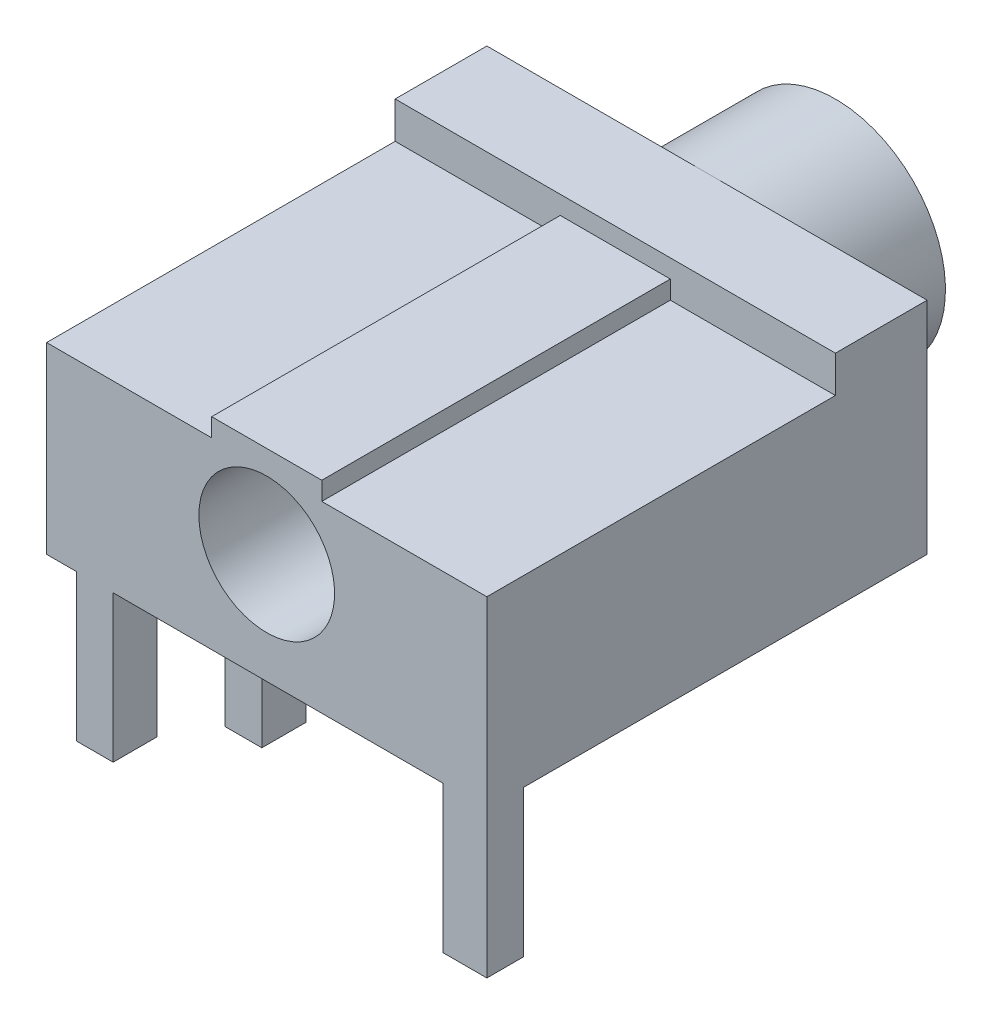
ISO-10303-21;
HEADER;
FILE_DESCRIPTION(('STEP AP214'),'2;1');
FILE_NAME('part.step','',(''),(''),'','','');
FILE_SCHEMA(('AUTOMOTIVE_DESIGN { 1 0 10303 214 1 1 1 1 }'));
ENDSEC;
DATA;
#1=APPLICATION_CONTEXT('core data for automotive mechanical design processes');
#2=APPLICATION_PROTOCOL_DEFINITION('international standard','automotive_design',2000,#1);
#3=PRODUCT_CONTEXT('',#1,'mechanical');
#4=PRODUCT('Part','Part','',(#3));
#5=PRODUCT_RELATED_PRODUCT_CATEGORY('part','',(#4));
#6=PRODUCT_DEFINITION_FORMATION('','',#4);
#7=PRODUCT_DEFINITION_CONTEXT('part definition',#1,'design');
#8=PRODUCT_DEFINITION('design','',#6,#7);
#9=PRODUCT_DEFINITION_SHAPE('','',#8);
#10=(LENGTH_UNIT() NAMED_UNIT(*) SI_UNIT(.MILLI.,.METRE.));
#11=(NAMED_UNIT(*) PLANE_ANGLE_UNIT() SI_UNIT($,.RADIAN.));
#12=(NAMED_UNIT(*) SI_UNIT($,.STERADIAN.) SOLID_ANGLE_UNIT());
#13=UNCERTAINTY_MEASURE_WITH_UNIT(LENGTH_MEASURE(1.E-05),#10,'distance_accuracy_value','');
#14=(GEOMETRIC_REPRESENTATION_CONTEXT(3) GLOBAL_UNCERTAINTY_ASSIGNED_CONTEXT((#13)) GLOBAL_UNIT_ASSIGNED_CONTEXT((#10,
#11,#12)) REPRESENTATION_CONTEXT('',''));
#15=CARTESIAN_POINT('',(0.,0.,0.));
#16=DIRECTION('',(0.,0.,1.));
#17=DIRECTION('',(1.,0.,0.));
#18=AXIS2_PLACEMENT_3D('',#15,#16,#17);
#19=CARTESIAN_POINT('',(0.,0.,0.));
#20=DIRECTION('',(0.,1.,0.));
#21=DIRECTION('',(0.,0.,1.));
#22=AXIS2_PLACEMENT_3D('',#19,#20,#21);
#23=PLANE('',#22);
#24=DIRECTION('',(0.,0.,-1.));
#25=VECTOR('',#24,1.);
#26=CARTESIAN_POINT('',(-1.2,0.,0.));
#27=LINE('',#26,#25);
#28=CARTESIAN_POINT('',(-1.2,0.,0.));
#29=VERTEX_POINT('',#28);
#30=CARTESIAN_POINT('',(-1.2,0.,-1.));
#31=VERTEX_POINT('',#30);
#32=EDGE_CURVE('E230',#29,#31,#27,.T.);
#33=ORIENTED_EDGE('',*,*,#32,.F.);
#34=DIRECTION('',(1.,0.,0.));
#35=VECTOR('',#34,1.);
#36=CARTESIAN_POINT('',(0.,0.,0.));
#37=LINE('',#36,#35);
#38=CARTESIAN_POINT('',(-10.1867010770763,0.,0.));
#39=VERTEX_POINT('',#38);
#40=EDGE_CURVE('E388',#39,#29,#37,.T.);
#41=ORIENTED_EDGE('',*,*,#40,.F.);
#42=DIRECTION('',(0.,0.,1.));
#43=VECTOR('',#42,1.);
#44=CARTESIAN_POINT('',(-10.1867010770763,0.,0.));
#45=LINE('',#44,#43);
#46=CARTESIAN_POINT('',(-10.1867010770763,0.,-1.2));
#47=VERTEX_POINT('',#46);
#48=EDGE_CURVE('E261',#47,#39,#45,.T.);
#49=ORIENTED_EDGE('',*,*,#48,.F.);
#50=DIRECTION('',(1.,0.,0.));
#51=VECTOR('',#50,1.);
#52=CARTESIAN_POINT('',(-11.1867010770763,0.,-1.2));
#53=LINE('',#52,#51);
#54=CARTESIAN_POINT('',(-11.1867010770763,0.,-1.2));
#55=VERTEX_POINT('',#54);
#56=EDGE_CURVE('E270',#55,#47,#53,.T.);
#57=ORIENTED_EDGE('',*,*,#56,.F.);
#58=DIRECTION('',(0.,0.,-1.));
#59=VECTOR('',#58,1.);
#60=CARTESIAN_POINT('',(-11.1867010770763,0.,0.));
#61=LINE('',#60,#59);
#62=CARTESIAN_POINT('',(-11.1867010770763,0.,0.));
#63=VERTEX_POINT('',#62);
#64=EDGE_CURVE('E256',#63,#55,#61,.T.);
#65=ORIENTED_EDGE('',*,*,#64,.F.);
#66=CARTESIAN_POINT('',(-12.,0.,0.));
#67=VERTEX_POINT('',#66);
#68=EDGE_CURVE('E372',#67,#63,#37,.T.);
#69=ORIENTED_EDGE('',*,*,#68,.F.);
#70=DIRECTION('',(0.,0.,1.));
#71=VECTOR('',#70,1.);
#72=CARTESIAN_POINT('',(-12.,0.,0.));
#73=LINE('',#72,#71);
#74=CARTESIAN_POINT('',(-12.,0.,-12.));
#75=VERTEX_POINT('',#74);
#76=EDGE_CURVE('E384',#75,#67,#73,.T.);
#77=ORIENTED_EDGE('',*,*,#76,.F.);
#78=DIRECTION('',(-1.,0.,0.));
#79=VECTOR('',#78,1.);
#80=CARTESIAN_POINT('',(0.,0.,-12.));
#81=LINE('',#80,#79);
#82=CARTESIAN_POINT('',(-9.5,0.,-12.));
#83=VERTEX_POINT('',#82);
#84=EDGE_CURVE('E380',#83,#75,#81,.T.);
#85=ORIENTED_EDGE('',*,*,#84,.F.);
#86=DIRECTION('',(0.,0.,-1.));
#87=VECTOR('',#86,1.);
#88=CARTESIAN_POINT('',(-9.5,0.,-12.));
#89=LINE('',#88,#87);
#90=CARTESIAN_POINT('',(-9.5,0.,-11.));
#91=VERTEX_POINT('',#90);
#92=EDGE_CURVE('E282',#91,#83,#89,.T.);
#93=ORIENTED_EDGE('',*,*,#92,.F.);
#94=DIRECTION('',(-1.,0.,0.));
#95=VECTOR('',#94,1.);
#96=CARTESIAN_POINT('',(-9.5,0.,-11.));
#97=LINE('',#96,#95);
#98=CARTESIAN_POINT('',(-8.3,0.,-11.));
#99=VERTEX_POINT('',#98);
#100=EDGE_CURVE('E287',#99,#91,#97,.T.);
#101=ORIENTED_EDGE('',*,*,#100,.F.);
#102=DIRECTION('',(0.,0.,1.));
#103=VECTOR('',#102,1.);
#104=CARTESIAN_POINT('',(-8.3,0.,-12.));
#105=LINE('',#104,#103);
#106=CARTESIAN_POINT('',(-8.3,0.,-12.));
#107=VERTEX_POINT('',#106);
#108=EDGE_CURVE('E296',#107,#99,#105,.T.);
#109=ORIENTED_EDGE('',*,*,#108,.F.);
#110=CARTESIAN_POINT('',(-6.,0.,-12.));
#111=VERTEX_POINT('',#110);
#112=EDGE_CURVE('E385',#111,#107,#81,.T.);
#113=ORIENTED_EDGE('',*,*,#112,.F.);
#114=CARTESIAN_POINT('',(0.,0.,-12.));
#115=VERTEX_POINT('',#114);
#116=EDGE_CURVE('E381',#115,#111,#81,.T.);
#117=ORIENTED_EDGE('',*,*,#116,.F.);
#118=DIRECTION('',(0.,0.,-1.));
#119=VECTOR('',#118,1.);
#120=CARTESIAN_POINT('',(0.,0.,0.));
#121=LINE('',#120,#119);
#122=CARTESIAN_POINT('',(0.,0.,-1.));
#123=VERTEX_POINT('',#122);
#124=EDGE_CURVE('E367',#123,#115,#121,.T.);
#125=ORIENTED_EDGE('',*,*,#124,.F.);
#126=DIRECTION('',(1.,0.,0.));
#127=VECTOR('',#126,1.);
#128=CARTESIAN_POINT('',(0.,0.,-1.));
#129=LINE('',#128,#127);
#130=EDGE_CURVE('E232',#31,#123,#129,.T.);
#131=ORIENTED_EDGE('',*,*,#130,.F.);
#132=EDGE_LOOP('',(#33,#41,#49,#57,#65,#69,#77,#85,#93,#101,#109,#113,#117,#125,#131));
#133=FACE_BOUND('',#132,.T.);
#134=DIRECTION('',(0.,0.,-1.));
#135=VECTOR('',#134,1.);
#136=CARTESIAN_POINT('',(-9.5,0.,-2.36712179431801));
#137=LINE('',#136,#135);
#138=CARTESIAN_POINT('',(-9.5,0.,-2.36712179431801));
#139=VERTEX_POINT('',#138);
#140=CARTESIAN_POINT('',(-9.5,0.,-3.56712179431801));
#141=VERTEX_POINT('',#140);
#142=EDGE_CURVE('E229',#139,#141,#137,.T.);
#143=ORIENTED_EDGE('',*,*,#142,.F.);
#144=DIRECTION('',(-1.,0.,0.));
#145=VECTOR('',#144,1.);
#146=CARTESIAN_POINT('',(-9.5,0.,-2.36712179431801));
#147=LINE('',#146,#145);
#148=CARTESIAN_POINT('',(-8.5,0.,-2.36712179431801));
#149=VERTEX_POINT('',#148);
#150=EDGE_CURVE('E226',#149,#139,#147,.T.);
#151=ORIENTED_EDGE('',*,*,#150,.F.);
#152=DIRECTION('',(0.,0.,1.));
#153=VECTOR('',#152,1.);
#154=CARTESIAN_POINT('',(-8.5,0.,-2.36712179431801));
#155=LINE('',#154,#153);
#156=CARTESIAN_POINT('',(-8.5,0.,-3.56712179431801));
#157=VERTEX_POINT('',#156);
#158=EDGE_CURVE('E56',#157,#149,#155,.T.);
#159=ORIENTED_EDGE('',*,*,#158,.F.);
#160=DIRECTION('',(1.,0.,0.));
#161=VECTOR('',#160,1.);
#162=CARTESIAN_POINT('',(-9.5,0.,-3.56712179431801));
#163=LINE('',#162,#161);
#164=EDGE_CURVE('E51',#141,#157,#163,.T.);
#165=ORIENTED_EDGE('',*,*,#164,.F.);
#166=EDGE_LOOP('',(#143,#151,#159,#165));
#167=FACE_BOUND('',#166,.T.);
#168=ADVANCED_FACE('F34',(#133,#167),#23,.F.);
#169=CARTESIAN_POINT('',(0.,6.,-12.));
#170=DIRECTION('',(0.,0.,1.));
#171=DIRECTION('',(1.,0.,0.));
#172=AXIS2_PLACEMENT_3D('',#169,#170,#171);
#173=PLANE('',#172);
#174=CARTESIAN_POINT('',(-6.,3.,-12.));
#175=DIRECTION('',(0.,0.,-1.));
#176=DIRECTION('',(-1.,0.,0.));
#177=AXIS2_PLACEMENT_3D('',#174,#175,#176);
#178=CIRCLE('',#177,3.);
#179=CARTESIAN_POINT('',(-6.,6.,-12.));
#180=VERTEX_POINT('',#179);
#181=EDGE_CURVE('E44',#180,#111,#178,.T.);
#182=ORIENTED_EDGE('',*,*,#181,.F.);
#183=DIRECTION('',(-1.,0.,0.));
#184=VECTOR('',#183,1.);
#185=CARTESIAN_POINT('',(0.,6.,-12.));
#186=LINE('',#185,#184);
#187=CARTESIAN_POINT('',(0.,6.,-12.));
#188=VERTEX_POINT('',#187);
#189=EDGE_CURVE('E373',#188,#180,#186,.T.);
#190=ORIENTED_EDGE('',*,*,#189,.F.);
#191=DIRECTION('',(0.,-1.,0.));
#192=VECTOR('',#191,1.);
#193=CARTESIAN_POINT('',(0.,6.,-12.));
#194=LINE('',#193,#192);
#195=EDGE_CURVE('E38',#188,#115,#194,.T.);
#196=ORIENTED_EDGE('',*,*,#195,.T.);
#197=ORIENTED_EDGE('',*,*,#116,.T.);
#198=EDGE_LOOP('',(#182,#190,#196,#197));
#199=FACE_BOUND('',#198,.T.);
#200=ADVANCED_FACE('F404',(#199),#173,.F.);
#201=CARTESIAN_POINT('',(-12.,5.,-9.5));
#202=DIRECTION('',(0.,0.,-1.));
#203=DIRECTION('',(-1.,0.,0.));
#204=AXIS2_PLACEMENT_3D('',#201,#202,#203);
#205=PLANE('',#204);
#206=DIRECTION('',(0.,-1.,0.));
#207=VECTOR('',#206,1.);
#208=CARTESIAN_POINT('',(-7.5,5.5,-9.5));
#209=LINE('',#208,#207);
#210=CARTESIAN_POINT('',(-7.5,5.5,-9.5));
#211=VERTEX_POINT('',#210);
#212=CARTESIAN_POINT('',(-7.5,5.,-9.5));
#213=VERTEX_POINT('',#212);
#214=EDGE_CURVE('E335',#211,#213,#209,.T.);
#215=ORIENTED_EDGE('',*,*,#214,.F.);
#216=DIRECTION('',(-1.,0.,0.));
#217=VECTOR('',#216,1.);
#218=CARTESIAN_POINT('',(-7.5,5.5,-9.5));
#219=LINE('',#218,#217);
#220=CARTESIAN_POINT('',(-4.5,5.5,-9.5));
#221=VERTEX_POINT('',#220);
#222=EDGE_CURVE('E332',#221,#211,#219,.T.);
#223=ORIENTED_EDGE('',*,*,#222,.F.);
#224=DIRECTION('',(0.,-1.,0.));
#225=VECTOR('',#224,1.);
#226=CARTESIAN_POINT('',(-4.5,5.5,-9.5));
#227=LINE('',#226,#225);
#228=CARTESIAN_POINT('',(-4.5,5.,-9.5));
#229=VERTEX_POINT('',#228);
#230=EDGE_CURVE('E342',#221,#229,#227,.T.);
#231=ORIENTED_EDGE('',*,*,#230,.T.);
#232=DIRECTION('',(-1.,0.,0.));
#233=VECTOR('',#232,1.);
#234=CARTESIAN_POINT('',(-12.,5.,-9.5));
#235=LINE('',#234,#233);
#236=CARTESIAN_POINT('',(0.,5.,-9.5));
#237=VERTEX_POINT('',#236);
#238=EDGE_CURVE('E360',#237,#229,#235,.T.);
#239=ORIENTED_EDGE('',*,*,#238,.F.);
#240=DIRECTION('',(0.,1.,0.));
#241=VECTOR('',#240,1.);
#242=CARTESIAN_POINT('',(0.,5.,-9.5));
#243=LINE('',#242,#241);
#244=CARTESIAN_POINT('',(0.,6.,-9.5));
#245=VERTEX_POINT('',#244);
#246=EDGE_CURVE('E362',#237,#245,#243,.T.);
#247=ORIENTED_EDGE('',*,*,#246,.T.);
#248=DIRECTION('',(-1.,0.,0.));
#249=VECTOR('',#248,1.);
#250=CARTESIAN_POINT('',(-12.,6.,-9.5));
#251=LINE('',#250,#249);
#252=CARTESIAN_POINT('',(-12.,6.,-9.5));
#253=VERTEX_POINT('',#252);
#254=EDGE_CURVE('E351',#245,#253,#251,.T.);
#255=ORIENTED_EDGE('',*,*,#254,.T.);
#256=DIRECTION('',(0.,1.,0.));
#257=VECTOR('',#256,1.);
#258=CARTESIAN_POINT('',(-12.,5.,-9.5));
#259=LINE('',#258,#257);
#260=CARTESIAN_POINT('',(-12.,5.,-9.5));
#261=VERTEX_POINT('',#260);
#262=EDGE_CURVE('E364',#261,#253,#259,.T.);
#263=ORIENTED_EDGE('',*,*,#262,.F.);
#264=EDGE_CURVE('E359',#213,#261,#235,.T.);
#265=ORIENTED_EDGE('',*,*,#264,.F.);
#266=EDGE_LOOP('',(#215,#223,#231,#239,#247,#255,#263,#265));
#267=FACE_BOUND('',#266,.T.);
#268=ADVANCED_FACE('F438',(#267),#205,.F.);
#269=CARTESIAN_POINT('',(0.,5.,0.));
#270=DIRECTION('',(0.,-1.,0.));
#271=DIRECTION('',(0.,0.,-1.));
#272=AXIS2_PLACEMENT_3D('',#269,#270,#271);
#273=PLANE('',#272);
#274=DIRECTION('',(0.,0.,1.));
#275=VECTOR('',#274,1.);
#276=CARTESIAN_POINT('',(-7.5,5.,0.));
#277=LINE('',#276,#275);
#278=CARTESIAN_POINT('',(-7.5,5.,0.));
#279=VERTEX_POINT('',#278);
#280=EDGE_CURVE('E320',#213,#279,#277,.T.);
#281=ORIENTED_EDGE('',*,*,#280,.F.);
#282=ORIENTED_EDGE('',*,*,#264,.T.);
#283=DIRECTION('',(0.,0.,1.));
#284=VECTOR('',#283,1.);
#285=CARTESIAN_POINT('',(-12.,5.,0.));
#286=LINE('',#285,#284);
#287=CARTESIAN_POINT('',(-12.,5.,0.));
#288=VERTEX_POINT('',#287);
#289=EDGE_CURVE('E352',#261,#288,#286,.T.);
#290=ORIENTED_EDGE('',*,*,#289,.T.);
#291=DIRECTION('',(1.,0.,0.));
#292=VECTOR('',#291,1.);
#293=CARTESIAN_POINT('',(-12.,5.,0.));
#294=LINE('',#293,#292);
#295=EDGE_CURVE('E355',#288,#279,#294,.T.);
#296=ORIENTED_EDGE('',*,*,#295,.T.);
#297=EDGE_LOOP('',(#281,#282,#290,#296));
#298=FACE_BOUND('',#297,.T.);
#299=ADVANCED_FACE('F434',(#298),#273,.F.);
#300=DIRECTION('',(0.,0.,-1.));
#301=VECTOR('',#300,1.);
#302=CARTESIAN_POINT('',(-4.5,5.,0.));
#303=LINE('',#302,#301);
#304=CARTESIAN_POINT('',(-4.5,5.,0.));
#305=VERTEX_POINT('',#304);
#306=EDGE_CURVE('E327',#305,#229,#303,.T.);
#307=ORIENTED_EDGE('',*,*,#306,.F.);
#308=CARTESIAN_POINT('',(0.,5.,0.));
#309=VERTEX_POINT('',#308);
#310=EDGE_CURVE('E354',#305,#309,#294,.T.);
#311=ORIENTED_EDGE('',*,*,#310,.T.);
#312=DIRECTION('',(0.,0.,-1.));
#313=VECTOR('',#312,1.);
#314=CARTESIAN_POINT('',(0.,5.,0.));
#315=LINE('',#314,#313);
#316=EDGE_CURVE('E357',#309,#237,#315,.T.);
#317=ORIENTED_EDGE('',*,*,#316,.T.);
#318=ORIENTED_EDGE('',*,*,#238,.T.);
#319=EDGE_LOOP('',(#307,#311,#317,#318));
#320=FACE_BOUND('',#319,.T.);
#321=ADVANCED_FACE('F476',(#320),#273,.F.);
#322=CARTESIAN_POINT('',(0.,6.,0.));
#323=DIRECTION('',(-1.,0.,0.));
#324=DIRECTION('',(0.,0.,1.));
#325=AXIS2_PLACEMENT_3D('',#322,#323,#324);
#326=PLANE('',#325);
#327=DIRECTION('',(0.,0.,-1.));
#328=VECTOR('',#327,1.);
#329=CARTESIAN_POINT('',(0.,6.,0.));
#330=LINE('',#329,#328);
#331=EDGE_CURVE('E369',#245,#188,#330,.T.);
#332=ORIENTED_EDGE('',*,*,#331,.F.);
#333=ORIENTED_EDGE('',*,*,#246,.F.);
#334=ORIENTED_EDGE('',*,*,#316,.F.);
#335=DIRECTION('',(0.,-1.,0.));
#336=VECTOR('',#335,1.);
#337=CARTESIAN_POINT('',(0.,6.,0.));
#338=LINE('',#337,#336);
#339=CARTESIAN_POINT('',(0.,-4.,0.));
#340=VERTEX_POINT('',#339);
#341=EDGE_CURVE('E378',#309,#340,#338,.T.);
#342=ORIENTED_EDGE('',*,*,#341,.T.);
#343=DIRECTION('',(0.,0.,1.));
#344=VECTOR('',#343,1.);
#345=CARTESIAN_POINT('',(0.,-4.,0.));
#346=LINE('',#345,#344);
#347=CARTESIAN_POINT('',(0.,-4.,-1.));
#348=VERTEX_POINT('',#347);
#349=EDGE_CURVE('E238',#348,#340,#346,.T.);
#350=ORIENTED_EDGE('',*,*,#349,.F.);
#351=DIRECTION('',(0.,1.,0.));
#352=VECTOR('',#351,1.);
#353=CARTESIAN_POINT('',(0.,-4.,-1.));
#354=LINE('',#353,#352);
#355=EDGE_CURVE('E246',#348,#123,#354,.T.);
#356=ORIENTED_EDGE('',*,*,#355,.T.);
#357=ORIENTED_EDGE('',*,*,#124,.T.);
#358=ORIENTED_EDGE('',*,*,#195,.F.);
#359=EDGE_LOOP('',(#332,#333,#334,#342,#350,#356,#357,#358));
#360=FACE_BOUND('',#359,.T.);
#361=ADVANCED_FACE('F36',(#360),#326,.F.);
#362=EDGE_CURVE('E11',#111,#180,#178,.T.);
#363=ORIENTED_EDGE('',*,*,#362,.F.);
#364=ORIENTED_EDGE('',*,*,#112,.T.);
#365=DIRECTION('',(0.,1.,0.));
#366=VECTOR('',#365,1.);
#367=CARTESIAN_POINT('',(-8.3,-4.,-12.));
#368=LINE('',#367,#366);
#369=CARTESIAN_POINT('',(-8.3,-4.,-12.));
#370=VERTEX_POINT('',#369);
#371=EDGE_CURVE('E306',#370,#107,#368,.T.);
#372=ORIENTED_EDGE('',*,*,#371,.F.);
#373=DIRECTION('',(1.,0.,0.));
#374=VECTOR('',#373,1.);
#375=CARTESIAN_POINT('',(-9.5,-4.,-12.));
#376=LINE('',#375,#374);
#377=CARTESIAN_POINT('',(-9.5,-4.,-12.));
#378=VERTEX_POINT('',#377);
#379=EDGE_CURVE('E286',#378,#370,#376,.T.);
#380=ORIENTED_EDGE('',*,*,#379,.F.);
#381=DIRECTION('',(0.,1.,0.));
#382=VECTOR('',#381,1.);
#383=CARTESIAN_POINT('',(-9.5,-4.,-12.));
#384=LINE('',#383,#382);
#385=EDGE_CURVE('E309',#378,#83,#384,.T.);
#386=ORIENTED_EDGE('',*,*,#385,.T.);
#387=ORIENTED_EDGE('',*,*,#84,.T.);
#388=DIRECTION('',(0.,-1.,0.));
#389=VECTOR('',#388,1.);
#390=CARTESIAN_POINT('',(-12.,6.,-12.));
#391=LINE('',#390,#389);
#392=CARTESIAN_POINT('',(-12.,6.,-12.));
#393=VERTEX_POINT('',#392);
#394=EDGE_CURVE('E393',#393,#75,#391,.T.);
#395=ORIENTED_EDGE('',*,*,#394,.F.);
#396=EDGE_CURVE('E371',#180,#393,#186,.T.);
#397=ORIENTED_EDGE('',*,*,#396,.F.);
#398=EDGE_LOOP('',(#363,#364,#372,#380,#386,#387,#395,#397));
#399=FACE_BOUND('',#398,.T.);
#400=ADVANCED_FACE('F419',(#399),#173,.F.);
#401=CARTESIAN_POINT('',(-12.,6.,0.));
#402=DIRECTION('',(1.,0.,0.));
#403=DIRECTION('',(0.,0.,-1.));
#404=AXIS2_PLACEMENT_3D('',#401,#402,#403);
#405=PLANE('',#404);
#406=ORIENTED_EDGE('',*,*,#289,.F.);
#407=ORIENTED_EDGE('',*,*,#262,.T.);
#408=DIRECTION('',(0.,0.,1.));
#409=VECTOR('',#408,1.);
#410=CARTESIAN_POINT('',(-12.,6.,0.));
#411=LINE('',#410,#409);
#412=EDGE_CURVE('E375',#393,#253,#411,.T.);
#413=ORIENTED_EDGE('',*,*,#412,.F.);
#414=ORIENTED_EDGE('',*,*,#394,.T.);
#415=ORIENTED_EDGE('',*,*,#76,.T.);
#416=DIRECTION('',(0.,-1.,0.));
#417=VECTOR('',#416,1.);
#418=CARTESIAN_POINT('',(-12.,6.,0.));
#419=LINE('',#418,#417);
#420=EDGE_CURVE('E392',#288,#67,#419,.T.);
#421=ORIENTED_EDGE('',*,*,#420,.F.);
#422=EDGE_LOOP('',(#406,#407,#413,#414,#415,#421));
#423=FACE_BOUND('',#422,.T.);
#424=ADVANCED_FACE('F426',(#423),#405,.F.);
#425=CARTESIAN_POINT('',(0.,6.,0.));
#426=DIRECTION('',(0.,0.,-1.));
#427=DIRECTION('',(-1.,0.,0.));
#428=AXIS2_PLACEMENT_3D('',#425,#426,#427);
#429=PLANE('',#428);
#430=CARTESIAN_POINT('',(-6.,3.,0.));
#431=DIRECTION('',(0.,0.,-1.));
#432=DIRECTION('',(-1.,0.,0.));
#433=AXIS2_PLACEMENT_3D('',#430,#431,#432);
#434=CIRCLE('',#433,1.85);
#435=CARTESIAN_POINT('',(-7.85,3.,0.));
#436=VERTEX_POINT('',#435);
#437=EDGE_CURVE('E313',#436,#436,#434,.T.);
#438=ORIENTED_EDGE('',*,*,#437,.T.);
#439=EDGE_LOOP('',(#438));
#440=FACE_BOUND('',#439,.T.);
#441=ORIENTED_EDGE('',*,*,#341,.F.);
#442=ORIENTED_EDGE('',*,*,#310,.F.);
#443=DIRECTION('',(0.,-1.,0.));
#444=VECTOR('',#443,1.);
#445=CARTESIAN_POINT('',(-4.5,5.5,0.));
#446=LINE('',#445,#444);
#447=CARTESIAN_POINT('',(-4.5,5.5,0.));
#448=VERTEX_POINT('',#447);
#449=EDGE_CURVE('E345',#448,#305,#446,.T.);
#450=ORIENTED_EDGE('',*,*,#449,.F.);
#451=DIRECTION('',(1.,0.,0.));
#452=VECTOR('',#451,1.);
#453=CARTESIAN_POINT('',(-7.5,5.5,0.));
#454=LINE('',#453,#452);
#455=CARTESIAN_POINT('',(-7.5,5.5,0.));
#456=VERTEX_POINT('',#455);
#457=EDGE_CURVE('E326',#456,#448,#454,.T.);
#458=ORIENTED_EDGE('',*,*,#457,.F.);
#459=DIRECTION('',(0.,-1.,0.));
#460=VECTOR('',#459,1.);
#461=CARTESIAN_POINT('',(-7.5,5.5,0.));
#462=LINE('',#461,#460);
#463=EDGE_CURVE('E348',#456,#279,#462,.T.);
#464=ORIENTED_EDGE('',*,*,#463,.T.);
#465=ORIENTED_EDGE('',*,*,#295,.F.);
#466=ORIENTED_EDGE('',*,*,#420,.T.);
#467=ORIENTED_EDGE('',*,*,#68,.T.);
#468=DIRECTION('',(0.,1.,0.));
#469=VECTOR('',#468,1.);
#470=CARTESIAN_POINT('',(-11.1867010770763,-4.,0.));
#471=LINE('',#470,#469);
#472=CARTESIAN_POINT('',(-11.1867010770763,-4.,0.));
#473=VERTEX_POINT('',#472);
#474=EDGE_CURVE('E267',#473,#63,#471,.T.);
#475=ORIENTED_EDGE('',*,*,#474,.F.);
#476=DIRECTION('',(-1.,0.,0.));
#477=VECTOR('',#476,1.);
#478=CARTESIAN_POINT('',(-11.1867010770763,-4.,0.));
#479=LINE('',#478,#477);
#480=CARTESIAN_POINT('',(-10.1867010770763,-4.,0.));
#481=VERTEX_POINT('',#480);
#482=EDGE_CURVE('E265',#481,#473,#479,.T.);
#483=ORIENTED_EDGE('',*,*,#482,.F.);
#484=DIRECTION('',(0.,1.,0.));
#485=VECTOR('',#484,1.);
#486=CARTESIAN_POINT('',(-10.1867010770763,-4.,0.));
#487=LINE('',#486,#485);
#488=EDGE_CURVE('E275',#481,#39,#487,.T.);
#489=ORIENTED_EDGE('',*,*,#488,.T.);
#490=ORIENTED_EDGE('',*,*,#40,.T.);
#491=DIRECTION('',(0.,1.,0.));
#492=VECTOR('',#491,1.);
#493=CARTESIAN_POINT('',(-1.2,-4.,0.));
#494=LINE('',#493,#492);
#495=CARTESIAN_POINT('',(-1.2,-4.,0.));
#496=VERTEX_POINT('',#495);
#497=EDGE_CURVE('E254',#496,#29,#494,.T.);
#498=ORIENTED_EDGE('',*,*,#497,.F.);
#499=DIRECTION('',(-1.,0.,0.));
#500=VECTOR('',#499,1.);
#501=CARTESIAN_POINT('',(0.,-4.,0.));
#502=LINE('',#501,#500);
#503=EDGE_CURVE('E241',#340,#496,#502,.T.);
#504=ORIENTED_EDGE('',*,*,#503,.F.);
#505=EDGE_LOOP('',(#441,#442,#450,#458,#464,#465,#466,#467,#475,#483,#489,#490,#498,#504));
#506=FACE_BOUND('',#505,.T.);
#507=ADVANCED_FACE('F430',(#440,#506),#429,.F.);
#508=CARTESIAN_POINT('',(0.,6.,0.));
#509=DIRECTION('',(0.,1.,0.));
#510=DIRECTION('',(0.,0.,1.));
#511=AXIS2_PLACEMENT_3D('',#508,#509,#510);
#512=PLANE('',#511);
#513=ORIENTED_EDGE('',*,*,#254,.F.);
#514=ORIENTED_EDGE('',*,*,#331,.T.);
#515=ORIENTED_EDGE('',*,*,#189,.T.);
#516=ORIENTED_EDGE('',*,*,#396,.T.);
#517=ORIENTED_EDGE('',*,*,#412,.T.);
#518=EDGE_LOOP('',(#513,#514,#515,#516,#517));
#519=FACE_BOUND('',#518,.T.);
#520=ADVANCED_FACE('F441',(#519),#512,.T.);
#521=CARTESIAN_POINT('',(-7.5,5.5,0.));
#522=DIRECTION('',(1.,0.,0.));
#523=DIRECTION('',(0.,0.,-1.));
#524=AXIS2_PLACEMENT_3D('',#521,#522,#523);
#525=PLANE('',#524);
#526=ORIENTED_EDGE('',*,*,#280,.T.);
#527=ORIENTED_EDGE('',*,*,#463,.F.);
#528=DIRECTION('',(0.,0.,1.));
#529=VECTOR('',#528,1.);
#530=CARTESIAN_POINT('',(-7.5,5.5,0.));
#531=LINE('',#530,#529);
#532=EDGE_CURVE('E323',#211,#456,#531,.T.);
#533=ORIENTED_EDGE('',*,*,#532,.F.);
#534=ORIENTED_EDGE('',*,*,#214,.T.);
#535=EDGE_LOOP('',(#526,#527,#533,#534));
#536=FACE_BOUND('',#535,.T.);
#537=ADVANCED_FACE('F486',(#536),#525,.F.);
#538=CARTESIAN_POINT('',(-4.5,5.5,0.));
#539=DIRECTION('',(-1.,0.,0.));
#540=DIRECTION('',(0.,0.,1.));
#541=AXIS2_PLACEMENT_3D('',#538,#539,#540);
#542=PLANE('',#541);
#543=ORIENTED_EDGE('',*,*,#306,.T.);
#544=ORIENTED_EDGE('',*,*,#230,.F.);
#545=DIRECTION('',(0.,0.,-1.));
#546=VECTOR('',#545,1.);
#547=CARTESIAN_POINT('',(-4.5,5.5,0.));
#548=LINE('',#547,#546);
#549=EDGE_CURVE('E329',#448,#221,#548,.T.);
#550=ORIENTED_EDGE('',*,*,#549,.F.);
#551=ORIENTED_EDGE('',*,*,#449,.T.);
#552=EDGE_LOOP('',(#543,#544,#550,#551));
#553=FACE_BOUND('',#552,.T.);
#554=ADVANCED_FACE('F456',(#553),#542,.F.);
#555=CARTESIAN_POINT('',(0.,5.5,0.));
#556=DIRECTION('',(0.,-1.,0.));
#557=DIRECTION('',(0.,0.,-1.));
#558=AXIS2_PLACEMENT_3D('',#555,#556,#557);
#559=PLANE('',#558);
#560=ORIENTED_EDGE('',*,*,#532,.T.);
#561=ORIENTED_EDGE('',*,*,#457,.T.);
#562=ORIENTED_EDGE('',*,*,#549,.T.);
#563=ORIENTED_EDGE('',*,*,#222,.T.);
#564=EDGE_LOOP('',(#560,#561,#562,#563));
#565=FACE_BOUND('',#564,.T.);
#566=ADVANCED_FACE('F446',(#565),#559,.F.);
#567=CARTESIAN_POINT('',(-6.,3.,-15.5));
#568=DIRECTION('',(0.,0.,1.));
#569=DIRECTION('',(1.,0.,0.));
#570=AXIS2_PLACEMENT_3D('',#567,#568,#569);
#571=CYLINDRICAL_SURFACE('',#570,3.);
#572=CARTESIAN_POINT('',(-6.,3.,-15.5));
#573=DIRECTION('',(0.,0.,-1.));
#574=DIRECTION('',(-1.,0.,0.));
#575=AXIS2_PLACEMENT_3D('',#572,#573,#574);
#576=CIRCLE('',#575,3.);
#577=CARTESIAN_POINT('',(-9.,3.,-15.5));
#578=VERTEX_POINT('',#577);
#579=EDGE_CURVE('E318',#578,#578,#576,.T.);
#580=ORIENTED_EDGE('',*,*,#579,.F.);
#581=EDGE_LOOP('',(#580));
#582=FACE_BOUND('',#581,.T.);
#583=ORIENTED_EDGE('',*,*,#181,.T.);
#584=ORIENTED_EDGE('',*,*,#362,.T.);
#585=EDGE_LOOP('',(#583,#584));
#586=FACE_BOUND('',#585,.T.);
#587=ADVANCED_FACE('F443',(#582,#586),#571,.T.);
#588=CARTESIAN_POINT('',(-6.,3.,-15.5));
#589=DIRECTION('',(0.,0.,-1.));
#590=DIRECTION('',(-1.,0.,0.));
#591=AXIS2_PLACEMENT_3D('',#588,#589,#590);
#592=PLANE('',#591);
#593=CARTESIAN_POINT('',(-6.,3.,-15.5));
#594=DIRECTION('',(0.,0.,-1.));
#595=DIRECTION('',(-1.,0.,0.));
#596=AXIS2_PLACEMENT_3D('',#593,#594,#595);
#597=CIRCLE('',#596,1.85);
#598=CARTESIAN_POINT('',(-7.85,3.,-15.5));
#599=VERTEX_POINT('',#598);
#600=EDGE_CURVE('E312',#599,#599,#597,.T.);
#601=ORIENTED_EDGE('',*,*,#600,.F.);
#602=EDGE_LOOP('',(#601));
#603=FACE_BOUND('',#602,.T.);
#604=ORIENTED_EDGE('',*,*,#579,.T.);
#605=EDGE_LOOP('',(#604));
#606=FACE_BOUND('',#605,.T.);
#607=ADVANCED_FACE('F445',(#603,#606),#592,.T.);
#608=CARTESIAN_POINT('',(-6.,3.,0.));
#609=DIRECTION('',(0.,0.,-1.));
#610=DIRECTION('',(-1.,0.,0.));
#611=AXIS2_PLACEMENT_3D('',#608,#609,#610);
#612=CYLINDRICAL_SURFACE('',#611,1.85);
#613=ORIENTED_EDGE('',*,*,#437,.F.);
#614=EDGE_LOOP('',(#613));
#615=FACE_BOUND('',#614,.T.);
#616=ORIENTED_EDGE('',*,*,#600,.T.);
#617=EDGE_LOOP('',(#616));
#618=FACE_BOUND('',#617,.T.);
#619=ADVANCED_FACE('F453',(#615,#618),#612,.F.);
#620=CARTESIAN_POINT('',(-9.5,-4.,-12.));
#621=DIRECTION('',(1.,0.,0.));
#622=DIRECTION('',(0.,0.,-1.));
#623=AXIS2_PLACEMENT_3D('',#620,#621,#622);
#624=PLANE('',#623);
#625=ORIENTED_EDGE('',*,*,#92,.T.);
#626=ORIENTED_EDGE('',*,*,#385,.F.);
#627=DIRECTION('',(0.,0.,-1.));
#628=VECTOR('',#627,1.);
#629=CARTESIAN_POINT('',(-9.5,-4.,-12.));
#630=LINE('',#629,#628);
#631=CARTESIAN_POINT('',(-9.5,-4.,-11.));
#632=VERTEX_POINT('',#631);
#633=EDGE_CURVE('E283',#632,#378,#630,.T.);
#634=ORIENTED_EDGE('',*,*,#633,.F.);
#635=DIRECTION('',(0.,1.,0.));
#636=VECTOR('',#635,1.);
#637=CARTESIAN_POINT('',(-9.5,-4.,-11.));
#638=LINE('',#637,#636);
#639=EDGE_CURVE('E293',#632,#91,#638,.T.);
#640=ORIENTED_EDGE('',*,*,#639,.T.);
#641=EDGE_LOOP('',(#625,#626,#634,#640));
#642=FACE_BOUND('',#641,.T.);
#643=ADVANCED_FACE('F555',(#642),#624,.F.);
#644=CARTESIAN_POINT('',(-8.3,-4.,-12.));
#645=DIRECTION('',(-1.,0.,0.));
#646=DIRECTION('',(0.,0.,1.));
#647=AXIS2_PLACEMENT_3D('',#644,#645,#646);
#648=PLANE('',#647);
#649=ORIENTED_EDGE('',*,*,#108,.T.);
#650=DIRECTION('',(0.,1.,0.));
#651=VECTOR('',#650,1.);
#652=CARTESIAN_POINT('',(-8.3,-4.,-11.));
#653=LINE('',#652,#651);
#654=CARTESIAN_POINT('',(-8.3,-4.,-11.));
#655=VERTEX_POINT('',#654);
#656=EDGE_CURVE('E303',#655,#99,#653,.T.);
#657=ORIENTED_EDGE('',*,*,#656,.F.);
#658=DIRECTION('',(0.,0.,1.));
#659=VECTOR('',#658,1.);
#660=CARTESIAN_POINT('',(-8.3,-4.,-12.));
#661=LINE('',#660,#659);
#662=EDGE_CURVE('E289',#370,#655,#661,.T.);
#663=ORIENTED_EDGE('',*,*,#662,.F.);
#664=ORIENTED_EDGE('',*,*,#371,.T.);
#665=EDGE_LOOP('',(#649,#657,#663,#664));
#666=FACE_BOUND('',#665,.T.);
#667=ADVANCED_FACE('F587',(#666),#648,.F.);
#668=CARTESIAN_POINT('',(-9.5,-4.,-11.));
#669=DIRECTION('',(0.,0.,-1.));
#670=DIRECTION('',(-1.,0.,0.));
#671=AXIS2_PLACEMENT_3D('',#668,#669,#670);
#672=PLANE('',#671);
#673=ORIENTED_EDGE('',*,*,#100,.T.);
#674=ORIENTED_EDGE('',*,*,#639,.F.);
#675=DIRECTION('',(-1.,0.,0.));
#676=VECTOR('',#675,1.);
#677=CARTESIAN_POINT('',(-9.5,-4.,-11.));
#678=LINE('',#677,#676);
#679=EDGE_CURVE('E291',#655,#632,#678,.T.);
#680=ORIENTED_EDGE('',*,*,#679,.F.);
#681=ORIENTED_EDGE('',*,*,#656,.T.);
#682=EDGE_LOOP('',(#673,#674,#680,#681));
#683=FACE_BOUND('',#682,.T.);
#684=ADVANCED_FACE('F597',(#683),#672,.F.);
#685=CARTESIAN_POINT('',(0.,-4.,0.));
#686=DIRECTION('',(0.,1.,0.));
#687=DIRECTION('',(0.,0.,1.));
#688=AXIS2_PLACEMENT_3D('',#685,#686,#687);
#689=PLANE('',#688);
#690=ORIENTED_EDGE('',*,*,#633,.T.);
#691=ORIENTED_EDGE('',*,*,#379,.T.);
#692=ORIENTED_EDGE('',*,*,#662,.T.);
#693=ORIENTED_EDGE('',*,*,#679,.T.);
#694=EDGE_LOOP('',(#690,#691,#692,#693));
#695=FACE_BOUND('',#694,.T.);
#696=ADVANCED_FACE('F607',(#695),#689,.F.);
#697=CARTESIAN_POINT('',(-11.1867010770763,-4.,0.));
#698=DIRECTION('',(1.,0.,0.));
#699=DIRECTION('',(0.,0.,-1.));
#700=AXIS2_PLACEMENT_3D('',#697,#698,#699);
#701=PLANE('',#700);
#702=ORIENTED_EDGE('',*,*,#64,.T.);
#703=DIRECTION('',(0.,1.,0.));
#704=VECTOR('',#703,1.);
#705=CARTESIAN_POINT('',(-11.1867010770763,-4.,-1.2));
#706=LINE('',#705,#704);
#707=CARTESIAN_POINT('',(-11.1867010770763,-4.,-1.2));
#708=VERTEX_POINT('',#707);
#709=EDGE_CURVE('E280',#708,#55,#706,.T.);
#710=ORIENTED_EDGE('',*,*,#709,.F.);
#711=DIRECTION('',(0.,0.,-1.));
#712=VECTOR('',#711,1.);
#713=CARTESIAN_POINT('',(-11.1867010770763,-4.,0.));
#714=LINE('',#713,#712);
#715=EDGE_CURVE('E257',#473,#708,#714,.T.);
#716=ORIENTED_EDGE('',*,*,#715,.F.);
#717=ORIENTED_EDGE('',*,*,#474,.T.);
#718=EDGE_LOOP('',(#702,#710,#716,#717));
#719=FACE_BOUND('',#718,.T.);
#720=ADVANCED_FACE('F617',(#719),#701,.F.);
#721=CARTESIAN_POINT('',(-11.1867010770763,-4.,-1.2));
#722=DIRECTION('',(0.,0.,1.));
#723=DIRECTION('',(1.,0.,0.));
#724=AXIS2_PLACEMENT_3D('',#721,#722,#723);
#725=PLANE('',#724);
#726=ORIENTED_EDGE('',*,*,#56,.T.);
#727=DIRECTION('',(0.,1.,0.));
#728=VECTOR('',#727,1.);
#729=CARTESIAN_POINT('',(-10.1867010770763,-4.,-1.2));
#730=LINE('',#729,#728);
#731=CARTESIAN_POINT('',(-10.1867010770763,-4.,-1.2));
#732=VERTEX_POINT('',#731);
#733=EDGE_CURVE('E277',#732,#47,#730,.T.);
#734=ORIENTED_EDGE('',*,*,#733,.F.);
#735=DIRECTION('',(1.,0.,0.));
#736=VECTOR('',#735,1.);
#737=CARTESIAN_POINT('',(-11.1867010770763,-4.,-1.2));
#738=LINE('',#737,#736);
#739=EDGE_CURVE('E260',#708,#732,#738,.T.);
#740=ORIENTED_EDGE('',*,*,#739,.F.);
#741=ORIENTED_EDGE('',*,*,#709,.T.);
#742=EDGE_LOOP('',(#726,#734,#740,#741));
#743=FACE_BOUND('',#742,.T.);
#744=ADVANCED_FACE('F627',(#743),#725,.F.);
#745=CARTESIAN_POINT('',(-10.1867010770763,-4.,0.));
#746=DIRECTION('',(-1.,0.,0.));
#747=DIRECTION('',(0.,0.,1.));
#748=AXIS2_PLACEMENT_3D('',#745,#746,#747);
#749=PLANE('',#748);
#750=ORIENTED_EDGE('',*,*,#48,.T.);
#751=ORIENTED_EDGE('',*,*,#488,.F.);
#752=DIRECTION('',(0.,0.,1.));
#753=VECTOR('',#752,1.);
#754=CARTESIAN_POINT('',(-10.1867010770763,-4.,0.));
#755=LINE('',#754,#753);
#756=EDGE_CURVE('E263',#732,#481,#755,.T.);
#757=ORIENTED_EDGE('',*,*,#756,.F.);
#758=ORIENTED_EDGE('',*,*,#733,.T.);
#759=EDGE_LOOP('',(#750,#751,#757,#758));
#760=FACE_BOUND('',#759,.T.);
#761=ADVANCED_FACE('F637',(#760),#749,.F.);
#762=CARTESIAN_POINT('',(0.,-4.,0.));
#763=DIRECTION('',(0.,-1.,0.));
#764=DIRECTION('',(0.,0.,-1.));
#765=AXIS2_PLACEMENT_3D('',#762,#763,#764);
#766=PLANE('',#765);
#767=ORIENTED_EDGE('',*,*,#715,.T.);
#768=ORIENTED_EDGE('',*,*,#739,.T.);
#769=ORIENTED_EDGE('',*,*,#756,.T.);
#770=ORIENTED_EDGE('',*,*,#482,.T.);
#771=EDGE_LOOP('',(#767,#768,#769,#770));
#772=FACE_BOUND('',#771,.T.);
#773=ADVANCED_FACE('F647',(#772),#766,.T.);
#774=CARTESIAN_POINT('',(-1.2,-4.,0.));
#775=DIRECTION('',(1.,0.,0.));
#776=DIRECTION('',(0.,0.,-1.));
#777=AXIS2_PLACEMENT_3D('',#774,#775,#776);
#778=PLANE('',#777);
#779=ORIENTED_EDGE('',*,*,#32,.T.);
#780=DIRECTION('',(0.,1.,0.));
#781=VECTOR('',#780,1.);
#782=CARTESIAN_POINT('',(-1.2,-4.,-1.));
#783=LINE('',#782,#781);
#784=CARTESIAN_POINT('',(-1.2,-4.,-1.));
#785=VERTEX_POINT('',#784);
#786=EDGE_CURVE('E251',#785,#31,#783,.T.);
#787=ORIENTED_EDGE('',*,*,#786,.F.);
#788=DIRECTION('',(0.,0.,-1.));
#789=VECTOR('',#788,1.);
#790=CARTESIAN_POINT('',(-1.2,-4.,0.));
#791=LINE('',#790,#789);
#792=EDGE_CURVE('E243',#496,#785,#791,.T.);
#793=ORIENTED_EDGE('',*,*,#792,.F.);
#794=ORIENTED_EDGE('',*,*,#497,.T.);
#795=EDGE_LOOP('',(#779,#787,#793,#794));
#796=FACE_BOUND('',#795,.T.);
#797=ADVANCED_FACE('F657',(#796),#778,.F.);
#798=CARTESIAN_POINT('',(0.,-4.,-1.));
#799=DIRECTION('',(0.,0.,1.));
#800=DIRECTION('',(1.,0.,0.));
#801=AXIS2_PLACEMENT_3D('',#798,#799,#800);
#802=PLANE('',#801);
#803=ORIENTED_EDGE('',*,*,#130,.T.);
#804=ORIENTED_EDGE('',*,*,#355,.F.);
#805=DIRECTION('',(1.,0.,0.));
#806=VECTOR('',#805,1.);
#807=CARTESIAN_POINT('',(0.,-4.,-1.));
#808=LINE('',#807,#806);
#809=EDGE_CURVE('E245',#785,#348,#808,.T.);
#810=ORIENTED_EDGE('',*,*,#809,.F.);
#811=ORIENTED_EDGE('',*,*,#786,.T.);
#812=EDGE_LOOP('',(#803,#804,#810,#811));
#813=FACE_BOUND('',#812,.T.);
#814=ADVANCED_FACE('F667',(#813),#802,.F.);
#815=CARTESIAN_POINT('',(0.,-4.,0.));
#816=DIRECTION('',(0.,1.,0.));
#817=DIRECTION('',(0.,0.,1.));
#818=AXIS2_PLACEMENT_3D('',#815,#816,#817);
#819=PLANE('',#818);
#820=ORIENTED_EDGE('',*,*,#349,.T.);
#821=ORIENTED_EDGE('',*,*,#503,.T.);
#822=ORIENTED_EDGE('',*,*,#792,.T.);
#823=ORIENTED_EDGE('',*,*,#809,.T.);
#824=EDGE_LOOP('',(#820,#821,#822,#823));
#825=FACE_BOUND('',#824,.T.);
#826=ADVANCED_FACE('F677',(#825),#819,.F.);
#827=CARTESIAN_POINT('',(-9.5,-4.,-2.36712179431801));
#828=DIRECTION('',(1.,0.,0.));
#829=DIRECTION('',(0.,0.,-1.));
#830=AXIS2_PLACEMENT_3D('',#827,#828,#829);
#831=PLANE('',#830);
#832=ORIENTED_EDGE('',*,*,#142,.T.);
#833=DIRECTION('',(0.,1.,0.));
#834=VECTOR('',#833,1.);
#835=CARTESIAN_POINT('',(-9.5,-4.,-3.56712179431801));
#836=LINE('',#835,#834);
#837=CARTESIAN_POINT('',(-9.5,-4.,-3.56712179431801));
#838=VERTEX_POINT('',#837);
#839=EDGE_CURVE('E210',#838,#141,#836,.T.);
#840=ORIENTED_EDGE('',*,*,#839,.F.);
#841=DIRECTION('',(0.,0.,-1.));
#842=VECTOR('',#841,1.);
#843=CARTESIAN_POINT('',(-9.5,-4.,-2.36712179431801));
#844=LINE('',#843,#842);
#845=CARTESIAN_POINT('',(-9.5,-4.,-2.36712179431801));
#846=VERTEX_POINT('',#845);
#847=EDGE_CURVE('E217',#846,#838,#844,.T.);
#848=ORIENTED_EDGE('',*,*,#847,.F.);
#849=DIRECTION('',(0.,1.,0.));
#850=VECTOR('',#849,1.);
#851=CARTESIAN_POINT('',(-9.5,-4.,-2.36712179431801));
#852=LINE('',#851,#850);
#853=EDGE_CURVE('E737',#846,#139,#852,.T.);
#854=ORIENTED_EDGE('',*,*,#853,.T.);
#855=EDGE_LOOP('',(#832,#840,#848,#854));
#856=FACE_BOUND('',#855,.T.);
#857=ADVANCED_FACE('F228',(#856),#831,.F.);
#858=CARTESIAN_POINT('',(-9.5,-4.,-3.56712179431801));
#859=DIRECTION('',(0.,0.,1.));
#860=DIRECTION('',(1.,0.,0.));
#861=AXIS2_PLACEMENT_3D('',#858,#859,#860);
#862=PLANE('',#861);
#863=ORIENTED_EDGE('',*,*,#164,.T.);
#864=DIRECTION('',(0.,1.,0.));
#865=VECTOR('',#864,1.);
#866=CARTESIAN_POINT('',(-8.5,-4.,-3.56712179431801));
#867=LINE('',#866,#865);
#868=CARTESIAN_POINT('',(-8.5,-4.,-3.56712179431801));
#869=VERTEX_POINT('',#868);
#870=EDGE_CURVE('E213',#869,#157,#867,.T.);
#871=ORIENTED_EDGE('',*,*,#870,.F.);
#872=DIRECTION('',(1.,0.,0.));
#873=VECTOR('',#872,1.);
#874=CARTESIAN_POINT('',(-9.5,-4.,-3.56712179431801));
#875=LINE('',#874,#873);
#876=EDGE_CURVE('E206',#838,#869,#875,.T.);
#877=ORIENTED_EDGE('',*,*,#876,.F.);
#878=ORIENTED_EDGE('',*,*,#839,.T.);
#879=EDGE_LOOP('',(#863,#871,#877,#878));
#880=FACE_BOUND('',#879,.T.);
#881=ADVANCED_FACE('F208',(#880),#862,.F.);
#882=CARTESIAN_POINT('',(-8.5,-4.,-2.36712179431801));
#883=DIRECTION('',(-1.,0.,0.));
#884=DIRECTION('',(0.,0.,1.));
#885=AXIS2_PLACEMENT_3D('',#882,#883,#884);
#886=PLANE('',#885);
#887=ORIENTED_EDGE('',*,*,#158,.T.);
#888=DIRECTION('',(0.,1.,0.));
#889=VECTOR('',#888,1.);
#890=CARTESIAN_POINT('',(-8.5,-4.,-2.36712179431801));
#891=LINE('',#890,#889);
#892=CARTESIAN_POINT('',(-8.5,-4.,-2.36712179431801));
#893=VERTEX_POINT('',#892);
#894=EDGE_CURVE('E234',#893,#149,#891,.T.);
#895=ORIENTED_EDGE('',*,*,#894,.F.);
#896=DIRECTION('',(0.,0.,1.));
#897=VECTOR('',#896,1.);
#898=CARTESIAN_POINT('',(-8.5,-4.,-2.36712179431801));
#899=LINE('',#898,#897);
#900=EDGE_CURVE('E216',#869,#893,#899,.T.);
#901=ORIENTED_EDGE('',*,*,#900,.F.);
#902=ORIENTED_EDGE('',*,*,#870,.T.);
#903=EDGE_LOOP('',(#887,#895,#901,#902));
#904=FACE_BOUND('',#903,.T.);
#905=ADVANCED_FACE('F704',(#904),#886,.F.);
#906=CARTESIAN_POINT('',(-9.5,-4.,-2.36712179431801));
#907=DIRECTION('',(0.,0.,-1.));
#908=DIRECTION('',(-1.,0.,0.));
#909=AXIS2_PLACEMENT_3D('',#906,#907,#908);
#910=PLANE('',#909);
#911=ORIENTED_EDGE('',*,*,#150,.T.);
#912=ORIENTED_EDGE('',*,*,#853,.F.);
#913=DIRECTION('',(-1.,0.,0.));
#914=VECTOR('',#913,1.);
#915=CARTESIAN_POINT('',(-9.5,-4.,-2.36712179431801));
#916=LINE('',#915,#914);
#917=EDGE_CURVE('E222',#893,#846,#916,.T.);
#918=ORIENTED_EDGE('',*,*,#917,.F.);
#919=ORIENTED_EDGE('',*,*,#894,.T.);
#920=EDGE_LOOP('',(#911,#912,#918,#919));
#921=FACE_BOUND('',#920,.T.);
#922=ADVANCED_FACE('F713',(#921),#910,.F.);
#923=CARTESIAN_POINT('',(0.,-4.,0.));
#924=DIRECTION('',(0.,-1.,0.));
#925=DIRECTION('',(0.,0.,-1.));
#926=AXIS2_PLACEMENT_3D('',#923,#924,#925);
#927=PLANE('',#926);
#928=ORIENTED_EDGE('',*,*,#847,.T.);
#929=ORIENTED_EDGE('',*,*,#876,.T.);
#930=ORIENTED_EDGE('',*,*,#900,.T.);
#931=ORIENTED_EDGE('',*,*,#917,.T.);
#932=EDGE_LOOP('',(#928,#929,#930,#931));
#933=FACE_BOUND('',#932,.T.);
#934=ADVANCED_FACE('F220',(#933),#927,.T.);
#935=CLOSED_SHELL('',(#168,#200,#268,#299,#321,#361,#400,#424,#507,#520,#537,#554,#566,#587,
#607,#619,#643,#667,#684,#696,#720,#744,#761,#773,#797,#814,#826,#857,#881,#905,#922,#934));
#936=MANIFOLD_SOLID_BREP('B2',#935);
#937=ADVANCED_BREP_SHAPE_REPRESENTATION('',(#18,#936),#14);
#938=SHAPE_DEFINITION_REPRESENTATION(#9,#937);
ENDSEC;
END-ISO-10303-21;
